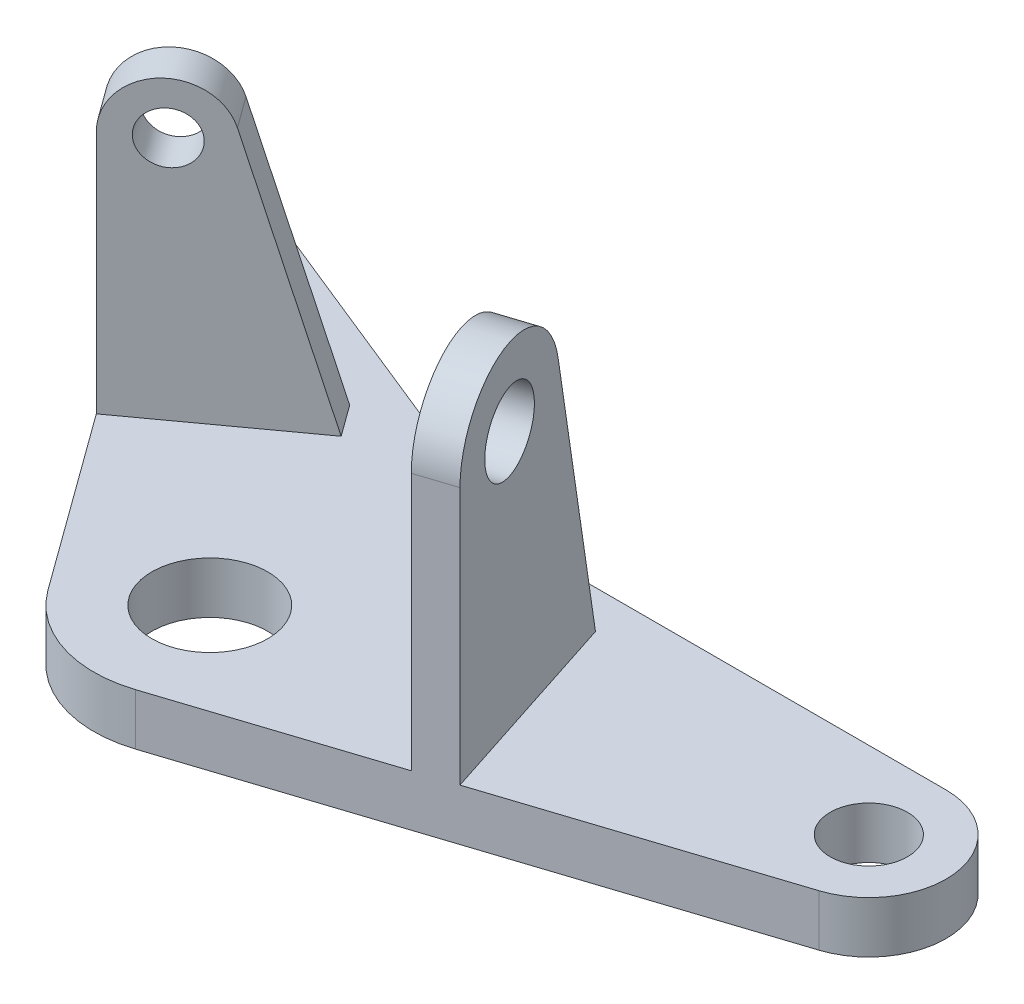
ISO-10303-21;
HEADER;
FILE_DESCRIPTION(('STEP AP214'),'2;1');
FILE_NAME('part.step','',(''),(''),'','','');
FILE_SCHEMA(('AUTOMOTIVE_DESIGN { 1 0 10303 214 1 1 1 1 }'));
ENDSEC;
DATA;
#1=APPLICATION_CONTEXT('core data for automotive mechanical design processes');
#2=APPLICATION_PROTOCOL_DEFINITION('international standard','automotive_design',2000,#1);
#3=PRODUCT_CONTEXT('',#1,'mechanical');
#4=PRODUCT('Part','Part','',(#3));
#5=PRODUCT_RELATED_PRODUCT_CATEGORY('part','',(#4));
#6=PRODUCT_DEFINITION_FORMATION('','',#4);
#7=PRODUCT_DEFINITION_CONTEXT('part definition',#1,'design');
#8=PRODUCT_DEFINITION('design','',#6,#7);
#9=PRODUCT_DEFINITION_SHAPE('','',#8);
#10=(LENGTH_UNIT() NAMED_UNIT(*) SI_UNIT(.MILLI.,.METRE.));
#11=(NAMED_UNIT(*) PLANE_ANGLE_UNIT() SI_UNIT($,.RADIAN.));
#12=(NAMED_UNIT(*) SI_UNIT($,.STERADIAN.) SOLID_ANGLE_UNIT());
#13=UNCERTAINTY_MEASURE_WITH_UNIT(LENGTH_MEASURE(1.E-05),#10,'distance_accuracy_value','');
#14=(GEOMETRIC_REPRESENTATION_CONTEXT(3) GLOBAL_UNCERTAINTY_ASSIGNED_CONTEXT((#13)) GLOBAL_UNIT_ASSIGNED_CONTEXT((#10,
#11,#12)) REPRESENTATION_CONTEXT('',''));
#15=CARTESIAN_POINT('',(0.,0.,0.));
#16=DIRECTION('',(0.,0.,1.));
#17=DIRECTION('',(1.,0.,0.));
#18=AXIS2_PLACEMENT_3D('',#15,#16,#17);
#19=CARTESIAN_POINT('',(0.,8.,0.));
#20=DIRECTION('',(0.,-1.,0.));
#21=DIRECTION('',(0.,0.,-1.));
#22=AXIS2_PLACEMENT_3D('',#19,#20,#21);
#23=PLANE('',#22);
#24=CARTESIAN_POINT('',(82.,8.,-20.3346417456682));
#25=DIRECTION('',(0.,1.,0.));
#26=DIRECTION('',(0.,0.,1.));
#27=AXIS2_PLACEMENT_3D('',#24,#25,#26);
#28=CIRCLE('',#27,6.);
#29=CARTESIAN_POINT('',(82.,8.,-14.3346417456682));
#30=VERTEX_POINT('',#29);
#31=EDGE_CURVE('E223',#30,#30,#28,.T.);
#32=ORIENTED_EDGE('',*,*,#31,.F.);
#33=EDGE_LOOP('',(#32));
#34=FACE_BOUND('',#33,.T.);
#35=CARTESIAN_POINT('',(-48.,8.,-49.0533160155749));
#36=DIRECTION('',(0.,1.,0.));
#37=DIRECTION('',(0.,0.,1.));
#38=AXIS2_PLACEMENT_3D('',#35,#36,#37);
#39=CIRCLE('',#38,4.00000000000001);
#40=CARTESIAN_POINT('',(-48.,8.,-45.0533160155749));
#41=VERTEX_POINT('',#40);
#42=EDGE_CURVE('E229',#41,#41,#39,.T.);
#43=ORIENTED_EDGE('',*,*,#42,.F.);
#44=EDGE_LOOP('',(#43));
#45=FACE_BOUND('',#44,.T.);
#46=CARTESIAN_POINT('',(0.,8.,0.));
#47=DIRECTION('',(0.,1.,0.));
#48=DIRECTION('',(0.,0.,1.));
#49=AXIS2_PLACEMENT_3D('',#46,#47,#48);
#50=CIRCLE('',#49,9.);
#51=CARTESIAN_POINT('',(0.,8.,9.));
#52=VERTEX_POINT('',#51);
#53=EDGE_CURVE('E235',#52,#52,#50,.T.);
#54=ORIENTED_EDGE('',*,*,#53,.F.);
#55=EDGE_LOOP('',(#54));
#56=FACE_BOUND('',#55,.T.);
#57=DIRECTION('',(-0.309016994374941,0.,-0.951056516295156));
#58=VECTOR('',#57,1.);
#59=CARTESIAN_POINT('',(38.0422606518062,8.,-12.3606797749976));
#60=LINE('',#59,#58);
#61=CARTESIAN_POINT('',(43.6045665505552,8.,4.75833751831514));
#62=VERTEX_POINT('',#61);
#63=CARTESIAN_POINT('',(33.477971610946,8.,-26.408117014963));
#64=VERTEX_POINT('',#63);
#65=EDGE_CURVE('E184',#62,#64,#60,.T.);
#66=ORIENTED_EDGE('',*,*,#65,.F.);
#67=DIRECTION('',(0.951056516295155,0.,-0.309016994374942));
#68=VECTOR('',#67,1.);
#69=CARTESIAN_POINT('',(85.7082039324993,8.,-8.92196355012631));
#70=LINE('',#69,#68);
#71=CARTESIAN_POINT('',(85.7082039324993,8.,-8.92196355012631));
#72=VERTEX_POINT('',#71);
#73=EDGE_CURVE('E155',#62,#72,#70,.T.);
#74=ORIENTED_EDGE('',*,*,#73,.T.);
#75=CARTESIAN_POINT('',(82.,8.,-20.3346417456682));
#76=DIRECTION('',(0.,1.,0.));
#77=DIRECTION('',(0.,0.,-1.));
#78=AXIS2_PLACEMENT_3D('',#75,#76,#77);
#79=CIRCLE('',#78,12.);
#80=CARTESIAN_POINT('',(82.,8.,-32.3346417456682));
#81=VERTEX_POINT('',#80);
#82=EDGE_CURVE('E248',#72,#81,#79,.T.);
#83=ORIENTED_EDGE('',*,*,#82,.T.);
#84=DIRECTION('',(-1.,0.,0.));
#85=VECTOR('',#84,1.);
#86=CARTESIAN_POINT('',(22.8998811762116,8.,-32.3346417456682));
#87=LINE('',#86,#85);
#88=CARTESIAN_POINT('',(22.8998811762116,8.,-32.3346417456682));
#89=VERTEX_POINT('',#88);
#90=EDGE_CURVE('E250',#81,#89,#87,.T.);
#91=ORIENTED_EDGE('',*,*,#90,.T.);
#92=CARTESIAN_POINT('',(22.8998811762116,8.,-74.3346417456682));
#93=DIRECTION('',(0.,-1.,0.));
#94=DIRECTION('',(0.,0.,1.));
#95=AXIS2_PLACEMENT_3D('',#92,#93,#94);
#96=CIRCLE('',#95,42.);
#97=CARTESIAN_POINT('',(7.16640425274329,8.,-35.3929198538631));
#98=VERTEX_POINT('',#97);
#99=EDGE_CURVE('E252',#89,#98,#96,.T.);
#100=ORIENTED_EDGE('',*,*,#99,.T.);
#101=DIRECTION('',(-0.927183854566787,0.,-0.374606593415913));
#102=VECTOR('',#101,1.);
#103=CARTESIAN_POINT('',(-45.0031472526727,8.,-56.4707868521092));
#104=LINE('',#103,#102);
#105=CARTESIAN_POINT('',(-45.0031472526727,8.,-56.4707868521092));
#106=VERTEX_POINT('',#105);
#107=EDGE_CURVE('E254',#98,#106,#104,.T.);
#108=ORIENTED_EDGE('',*,*,#107,.T.);
#109=CARTESIAN_POINT('',(-48.,8.,-49.0533160155749));
#110=DIRECTION('',(0.,1.,0.));
#111=DIRECTION('',(0.,0.,-1.));
#112=AXIS2_PLACEMENT_3D('',#109,#110,#111);
#113=CIRCLE('',#112,8.00000000000001);
#114=CARTESIAN_POINT('',(-54.4721359549996,8.,-44.3510339972351));
#115=VERTEX_POINT('',#114);
#116=EDGE_CURVE('E256',#106,#115,#113,.T.);
#117=ORIENTED_EDGE('',*,*,#116,.T.);
#118=DIRECTION('',(0.587785252292478,0.,0.809016994374944));
#119=VECTOR('',#118,1.);
#120=CARTESIAN_POINT('',(-14.562305898749,8.,10.5801345412646));
#121=LINE('',#120,#119);
#122=CARTESIAN_POINT('',(-38.0737159904481,8.,-21.7805452337332));
#123=VERTEX_POINT('',#122);
#124=EDGE_CURVE('E259',#115,#123,#121,.T.);
#125=ORIENTED_EDGE('',*,*,#124,.T.);
#126=DIRECTION('',(0.809016994374944,0.,-0.587785252292478));
#127=VECTOR('',#126,1.);
#128=CARTESIAN_POINT('',(-23.5114100916991,8.,-32.3606797749978));
#129=LINE('',#128,#127);
#130=CARTESIAN_POINT('',(-16.0533088274187,8.,-37.7793075216681));
#131=VERTEX_POINT('',#130);
#132=EDGE_CURVE('E57',#123,#131,#129,.T.);
#133=ORIENTED_EDGE('',*,*,#132,.T.);
#134=DIRECTION('',(0.587785252292478,0.,0.809016994374944));
#135=VECTOR('',#134,1.);
#136=CARTESIAN_POINT('',(7.45810126428037,8.,-5.41862774667031));
#137=LINE('',#136,#135);
#138=CARTESIAN_POINT('',(-12.5265973136639,8.,-32.9252055554184));
#139=VERTEX_POINT('',#138);
#140=EDGE_CURVE('E220',#131,#139,#137,.T.);
#141=ORIENTED_EDGE('',*,*,#140,.T.);
#142=DIRECTION('',(0.809016994374944,0.,-0.587785252292478));
#143=VECTOR('',#142,1.);
#144=CARTESIAN_POINT('',(-19.9846985779443,8.,-27.5065778087481));
#145=LINE('',#144,#143);
#146=CARTESIAN_POINT('',(-34.5470044766932,8.,-16.9264432674835));
#147=VERTEX_POINT('',#146);
#148=EDGE_CURVE('E214',#147,#139,#145,.T.);
#149=ORIENTED_EDGE('',*,*,#148,.F.);
#150=CARTESIAN_POINT('',(-14.562305898749,8.,10.5801345412646));
#151=VERTEX_POINT('',#150);
#152=EDGE_CURVE('E258',#147,#151,#121,.T.);
#153=ORIENTED_EDGE('',*,*,#152,.T.);
#154=CARTESIAN_POINT('',(0.,8.,0.));
#155=DIRECTION('',(0.,1.,0.));
#156=DIRECTION('',(0.,0.,-1.));
#157=AXIS2_PLACEMENT_3D('',#154,#155,#156);
#158=CIRCLE('',#157,18.);
#159=CARTESIAN_POINT('',(5.56230589874895,8.,17.1190172933128));
#160=VERTEX_POINT('',#159);
#161=EDGE_CURVE('E241',#151,#160,#158,.T.);
#162=ORIENTED_EDGE('',*,*,#161,.T.);
#163=CARTESIAN_POINT('',(37.8982274527842,8.,6.61243948456478));
#164=VERTEX_POINT('',#163);
#165=EDGE_CURVE('E245',#160,#164,#70,.T.);
#166=ORIENTED_EDGE('',*,*,#165,.T.);
#167=DIRECTION('',(-0.309016994374941,0.,-0.951056516295156));
#168=VECTOR('',#167,1.);
#169=CARTESIAN_POINT('',(32.3359215540353,8.,-10.506577808748));
#170=LINE('',#169,#168);
#171=CARTESIAN_POINT('',(27.771632513175,8.,-24.5540150487134));
#172=VERTEX_POINT('',#171);
#173=EDGE_CURVE('E180',#164,#172,#170,.T.);
#174=ORIENTED_EDGE('',*,*,#173,.T.);
#175=DIRECTION('',(0.951056516295156,0.,-0.309016994374941));
#176=VECTOR('',#175,1.);
#177=CARTESIAN_POINT('',(-4.56428904086026,8.,-14.0474372399654));
#178=LINE('',#177,#176);
#179=EDGE_CURVE('E186',#172,#64,#178,.T.);
#180=ORIENTED_EDGE('',*,*,#179,.T.);
#181=EDGE_LOOP('',(#66,#74,#83,#91,#100,#108,#117,#125,#133,#141,#149,#153,#162,#166,#174,#180));
#182=FACE_BOUND('',#181,.T.);
#183=ADVANCED_FACE('F34',(#34,#45,#56,#182),#23,.F.);
#184=CARTESIAN_POINT('',(0.,0.,0.));
#185=DIRECTION('',(0.,-1.,0.));
#186=DIRECTION('',(0.,0.,-1.));
#187=AXIS2_PLACEMENT_3D('',#184,#185,#186);
#188=PLANE('',#187);
#189=CARTESIAN_POINT('',(82.,0.,-20.3346417456682));
#190=DIRECTION('',(0.,1.,0.));
#191=DIRECTION('',(0.,0.,-1.));
#192=AXIS2_PLACEMENT_3D('',#189,#190,#191);
#193=CIRCLE('',#192,12.);
#194=CARTESIAN_POINT('',(85.7082039324993,0.,-8.92196355012631));
#195=VERTEX_POINT('',#194);
#196=CARTESIAN_POINT('',(82.,0.,-32.3346417456682));
#197=VERTEX_POINT('',#196);
#198=EDGE_CURVE('E266',#195,#197,#193,.T.);
#199=ORIENTED_EDGE('',*,*,#198,.F.);
#200=DIRECTION('',(0.951056516295155,0.,-0.309016994374942));
#201=VECTOR('',#200,1.);
#202=CARTESIAN_POINT('',(85.7082039324993,0.,-8.92196355012631));
#203=LINE('',#202,#201);
#204=CARTESIAN_POINT('',(5.56230589874895,0.,17.1190172933128));
#205=VERTEX_POINT('',#204);
#206=EDGE_CURVE('E264',#205,#195,#203,.T.);
#207=ORIENTED_EDGE('',*,*,#206,.F.);
#208=CARTESIAN_POINT('',(0.,0.,0.));
#209=DIRECTION('',(0.,1.,0.));
#210=DIRECTION('',(0.,0.,-1.));
#211=AXIS2_PLACEMENT_3D('',#208,#209,#210);
#212=CIRCLE('',#211,18.);
#213=CARTESIAN_POINT('',(-14.562305898749,0.,10.5801345412646));
#214=VERTEX_POINT('',#213);
#215=EDGE_CURVE('E238',#214,#205,#212,.T.);
#216=ORIENTED_EDGE('',*,*,#215,.F.);
#217=DIRECTION('',(0.587785252292478,0.,0.809016994374944));
#218=VECTOR('',#217,1.);
#219=CARTESIAN_POINT('',(-14.562305898749,0.,10.5801345412646));
#220=LINE('',#219,#218);
#221=CARTESIAN_POINT('',(-54.4721359549996,0.,-44.3510339972351));
#222=VERTEX_POINT('',#221);
#223=EDGE_CURVE('E244',#222,#214,#220,.T.);
#224=ORIENTED_EDGE('',*,*,#223,.F.);
#225=CARTESIAN_POINT('',(-48.,0.,-49.0533160155749));
#226=DIRECTION('',(0.,1.,0.));
#227=DIRECTION('',(0.,0.,-1.));
#228=AXIS2_PLACEMENT_3D('',#225,#226,#227);
#229=CIRCLE('',#228,8.00000000000001);
#230=CARTESIAN_POINT('',(-45.0031472526727,0.,-56.4707868521092));
#231=VERTEX_POINT('',#230);
#232=EDGE_CURVE('E274',#231,#222,#229,.T.);
#233=ORIENTED_EDGE('',*,*,#232,.F.);
#234=DIRECTION('',(-0.927183854566787,0.,-0.374606593415913));
#235=VECTOR('',#234,1.);
#236=CARTESIAN_POINT('',(-45.0031472526727,0.,-56.4707868521092));
#237=LINE('',#236,#235);
#238=CARTESIAN_POINT('',(7.16640425274329,0.,-35.3929198538631));
#239=VERTEX_POINT('',#238);
#240=EDGE_CURVE('E272',#239,#231,#237,.T.);
#241=ORIENTED_EDGE('',*,*,#240,.F.);
#242=CARTESIAN_POINT('',(22.8998811762116,0.,-74.3346417456682));
#243=DIRECTION('',(0.,-1.,0.));
#244=DIRECTION('',(0.,0.,1.));
#245=AXIS2_PLACEMENT_3D('',#242,#243,#244);
#246=CIRCLE('',#245,42.);
#247=CARTESIAN_POINT('',(22.8998811762116,0.,-32.3346417456682));
#248=VERTEX_POINT('',#247);
#249=EDGE_CURVE('E270',#248,#239,#246,.T.);
#250=ORIENTED_EDGE('',*,*,#249,.F.);
#251=DIRECTION('',(-1.,0.,0.));
#252=VECTOR('',#251,1.);
#253=CARTESIAN_POINT('',(22.8998811762116,0.,-32.3346417456682));
#254=LINE('',#253,#252);
#255=EDGE_CURVE('E268',#197,#248,#254,.T.);
#256=ORIENTED_EDGE('',*,*,#255,.F.);
#257=EDGE_LOOP('',(#199,#207,#216,#224,#233,#241,#250,#256));
#258=FACE_BOUND('',#257,.T.);
#259=CARTESIAN_POINT('',(-48.,0.,-49.0533160155749));
#260=DIRECTION('',(0.,1.,0.));
#261=DIRECTION('',(0.,0.,1.));
#262=AXIS2_PLACEMENT_3D('',#259,#260,#261);
#263=CIRCLE('',#262,4.00000000000001);
#264=CARTESIAN_POINT('',(-48.,0.,-45.0533160155749));
#265=VERTEX_POINT('',#264);
#266=EDGE_CURVE('E226',#265,#265,#263,.T.);
#267=ORIENTED_EDGE('',*,*,#266,.T.);
#268=EDGE_LOOP('',(#267));
#269=FACE_BOUND('',#268,.T.);
#270=CARTESIAN_POINT('',(0.,0.,0.));
#271=DIRECTION('',(0.,1.,0.));
#272=DIRECTION('',(0.,0.,1.));
#273=AXIS2_PLACEMENT_3D('',#270,#271,#272);
#274=CIRCLE('',#273,9.);
#275=CARTESIAN_POINT('',(0.,0.,9.));
#276=VERTEX_POINT('',#275);
#277=EDGE_CURVE('E232',#276,#276,#274,.T.);
#278=ORIENTED_EDGE('',*,*,#277,.T.);
#279=EDGE_LOOP('',(#278));
#280=FACE_BOUND('',#279,.T.);
#281=CARTESIAN_POINT('',(82.,0.,-20.3346417456682));
#282=DIRECTION('',(0.,1.,0.));
#283=DIRECTION('',(0.,0.,1.));
#284=AXIS2_PLACEMENT_3D('',#281,#282,#283);
#285=CIRCLE('',#284,6.);
#286=CARTESIAN_POINT('',(82.,0.,-14.3346417456682));
#287=VERTEX_POINT('',#286);
#288=EDGE_CURVE('E222',#287,#287,#285,.T.);
#289=ORIENTED_EDGE('',*,*,#288,.T.);
#290=EDGE_LOOP('',(#289));
#291=FACE_BOUND('',#290,.T.);
#292=ADVANCED_FACE('F301',(#258,#269,#280,#291),#188,.T.);
#293=CARTESIAN_POINT('',(0.,8.,0.));
#294=DIRECTION('',(0.,-1.,0.));
#295=DIRECTION('',(0.,0.,-1.));
#296=AXIS2_PLACEMENT_3D('',#293,#294,#295);
#297=CYLINDRICAL_SURFACE('',#296,18.);
#298=ORIENTED_EDGE('',*,*,#215,.T.);
#299=DIRECTION('',(0.,-1.,0.));
#300=VECTOR('',#299,1.);
#301=CARTESIAN_POINT('',(5.56230589874895,8.,17.1190172933128));
#302=LINE('',#301,#300);
#303=EDGE_CURVE('E11',#160,#205,#302,.T.);
#304=ORIENTED_EDGE('',*,*,#303,.F.);
#305=ORIENTED_EDGE('',*,*,#161,.F.);
#306=DIRECTION('',(0.,-1.,0.));
#307=VECTOR('',#306,1.);
#308=CARTESIAN_POINT('',(-14.562305898749,8.,10.5801345412646));
#309=LINE('',#308,#307);
#310=EDGE_CURVE('E261',#151,#214,#309,.T.);
#311=ORIENTED_EDGE('',*,*,#310,.T.);
#312=EDGE_LOOP('',(#298,#304,#305,#311));
#313=FACE_BOUND('',#312,.T.);
#314=ADVANCED_FACE('F36',(#313),#297,.T.);
#315=CARTESIAN_POINT('',(85.7082039324993,8.,-8.92196355012631));
#316=DIRECTION('',(-0.309016994374942,0.,-0.951056516295155));
#317=DIRECTION('',(-0.951056516295155,0.,0.309016994374942));
#318=AXIS2_PLACEMENT_3D('',#315,#316,#317);
#319=PLANE('',#318);
#320=ORIENTED_EDGE('',*,*,#206,.T.);
#321=DIRECTION('',(0.,-1.,0.));
#322=VECTOR('',#321,1.);
#323=CARTESIAN_POINT('',(85.7082039324993,8.,-8.92196355012631));
#324=LINE('',#323,#322);
#325=EDGE_CURVE('E42',#72,#195,#324,.T.);
#326=ORIENTED_EDGE('',*,*,#325,.F.);
#327=ORIENTED_EDGE('',*,*,#73,.F.);
#328=DIRECTION('',(0.,1.,0.));
#329=VECTOR('',#328,1.);
#330=CARTESIAN_POINT('',(43.6045665505552,0.,4.75833751831514));
#331=LINE('',#330,#329);
#332=CARTESIAN_POINT('',(43.6045665505552,48.,4.75833751831514));
#333=VERTEX_POINT('',#332);
#334=EDGE_CURVE('E148',#62,#333,#331,.T.);
#335=ORIENTED_EDGE('',*,*,#334,.T.);
#336=DIRECTION('',(-0.951056516295155,0.,0.309016994374941));
#337=VECTOR('',#336,1.);
#338=CARTESIAN_POINT('',(43.6045665505552,48.,4.75833751831514));
#339=LINE('',#338,#337);
#340=CARTESIAN_POINT('',(37.8982274527842,48.,6.61243948456479));
#341=VERTEX_POINT('',#340);
#342=EDGE_CURVE('E152',#333,#341,#339,.T.);
#343=ORIENTED_EDGE('',*,*,#342,.T.);
#344=DIRECTION('',(0.,1.,0.));
#345=VECTOR('',#344,1.);
#346=CARTESIAN_POINT('',(37.8982274527842,0.,6.61243948456478));
#347=LINE('',#346,#345);
#348=EDGE_CURVE('E175',#164,#341,#347,.T.);
#349=ORIENTED_EDGE('',*,*,#348,.F.);
#350=ORIENTED_EDGE('',*,*,#165,.F.);
#351=ORIENTED_EDGE('',*,*,#303,.T.);
#352=EDGE_LOOP('',(#320,#326,#327,#335,#343,#349,#350,#351));
#353=FACE_BOUND('',#352,.T.);
#354=ADVANCED_FACE('F150',(#353),#319,.F.);
#355=CARTESIAN_POINT('',(82.,8.,-20.3346417456682));
#356=DIRECTION('',(0.,-1.,0.));
#357=DIRECTION('',(0.,0.,-1.));
#358=AXIS2_PLACEMENT_3D('',#355,#356,#357);
#359=CYLINDRICAL_SURFACE('',#358,12.);
#360=ORIENTED_EDGE('',*,*,#198,.T.);
#361=DIRECTION('',(0.,-1.,0.));
#362=VECTOR('',#361,1.);
#363=CARTESIAN_POINT('',(82.,8.,-32.3346417456682));
#364=LINE('',#363,#362);
#365=EDGE_CURVE('E291',#81,#197,#364,.T.);
#366=ORIENTED_EDGE('',*,*,#365,.F.);
#367=ORIENTED_EDGE('',*,*,#82,.F.);
#368=ORIENTED_EDGE('',*,*,#325,.T.);
#369=EDGE_LOOP('',(#360,#366,#367,#368));
#370=FACE_BOUND('',#369,.T.);
#371=ADVANCED_FACE('F297',(#370),#359,.T.);
#372=CARTESIAN_POINT('',(22.8998811762116,8.,-32.3346417456682));
#373=DIRECTION('',(0.,0.,1.));
#374=DIRECTION('',(1.,0.,0.));
#375=AXIS2_PLACEMENT_3D('',#372,#373,#374);
#376=PLANE('',#375);
#377=ORIENTED_EDGE('',*,*,#255,.T.);
#378=DIRECTION('',(0.,-1.,0.));
#379=VECTOR('',#378,1.);
#380=CARTESIAN_POINT('',(22.8998811762116,8.,-32.3346417456682));
#381=LINE('',#380,#379);
#382=EDGE_CURVE('E288',#89,#248,#381,.T.);
#383=ORIENTED_EDGE('',*,*,#382,.F.);
#384=ORIENTED_EDGE('',*,*,#90,.F.);
#385=ORIENTED_EDGE('',*,*,#365,.T.);
#386=EDGE_LOOP('',(#377,#383,#384,#385));
#387=FACE_BOUND('',#386,.T.);
#388=ADVANCED_FACE('F308',(#387),#376,.F.);
#389=CARTESIAN_POINT('',(22.8998811762116,8.,-74.3346417456682));
#390=DIRECTION('',(0.,-1.,0.));
#391=DIRECTION('',(0.,0.,-1.));
#392=AXIS2_PLACEMENT_3D('',#389,#390,#391);
#393=CYLINDRICAL_SURFACE('',#392,42.);
#394=ORIENTED_EDGE('',*,*,#249,.T.);
#395=DIRECTION('',(0.,-1.,0.));
#396=VECTOR('',#395,1.);
#397=CARTESIAN_POINT('',(7.16640425274329,8.,-35.3929198538631));
#398=LINE('',#397,#396);
#399=EDGE_CURVE('E285',#98,#239,#398,.T.);
#400=ORIENTED_EDGE('',*,*,#399,.F.);
#401=ORIENTED_EDGE('',*,*,#99,.F.);
#402=ORIENTED_EDGE('',*,*,#382,.T.);
#403=EDGE_LOOP('',(#394,#400,#401,#402));
#404=FACE_BOUND('',#403,.T.);
#405=ADVANCED_FACE('F312',(#404),#393,.F.);
#406=CARTESIAN_POINT('',(-45.0031472526727,8.,-56.4707868521092));
#407=DIRECTION('',(-0.374606593415913,0.,0.927183854566787));
#408=DIRECTION('',(0.927183854566787,0.,0.374606593415913));
#409=AXIS2_PLACEMENT_3D('',#406,#407,#408);
#410=PLANE('',#409);
#411=ORIENTED_EDGE('',*,*,#240,.T.);
#412=DIRECTION('',(0.,-1.,0.));
#413=VECTOR('',#412,1.);
#414=CARTESIAN_POINT('',(-45.0031472526727,8.,-56.4707868521092));
#415=LINE('',#414,#413);
#416=EDGE_CURVE('E282',#106,#231,#415,.T.);
#417=ORIENTED_EDGE('',*,*,#416,.F.);
#418=ORIENTED_EDGE('',*,*,#107,.F.);
#419=ORIENTED_EDGE('',*,*,#399,.T.);
#420=EDGE_LOOP('',(#411,#417,#418,#419));
#421=FACE_BOUND('',#420,.T.);
#422=ADVANCED_FACE('F334',(#421),#410,.F.);
#423=CARTESIAN_POINT('',(-48.,8.,-49.0533160155749));
#424=DIRECTION('',(0.,-1.,0.));
#425=DIRECTION('',(0.,0.,-1.));
#426=AXIS2_PLACEMENT_3D('',#423,#424,#425);
#427=CYLINDRICAL_SURFACE('',#426,8.00000000000001);
#428=ORIENTED_EDGE('',*,*,#232,.T.);
#429=DIRECTION('',(0.,-1.,0.));
#430=VECTOR('',#429,1.);
#431=CARTESIAN_POINT('',(-54.4721359549996,8.,-44.3510339972351));
#432=LINE('',#431,#430);
#433=EDGE_CURVE('E279',#115,#222,#432,.T.);
#434=ORIENTED_EDGE('',*,*,#433,.F.);
#435=ORIENTED_EDGE('',*,*,#116,.F.);
#436=ORIENTED_EDGE('',*,*,#416,.T.);
#437=EDGE_LOOP('',(#428,#434,#435,#436));
#438=FACE_BOUND('',#437,.T.);
#439=ADVANCED_FACE('F332',(#438),#427,.T.);
#440=CARTESIAN_POINT('',(-14.562305898749,8.,10.5801345412646));
#441=DIRECTION('',(0.809016994374944,0.,-0.587785252292478));
#442=DIRECTION('',(-0.587785252292478,0.,-0.809016994374944));
#443=AXIS2_PLACEMENT_3D('',#440,#441,#442);
#444=PLANE('',#443);
#445=ORIENTED_EDGE('',*,*,#223,.T.);
#446=ORIENTED_EDGE('',*,*,#310,.F.);
#447=ORIENTED_EDGE('',*,*,#152,.F.);
#448=DIRECTION('',(0.,-1.,0.));
#449=VECTOR('',#448,1.);
#450=CARTESIAN_POINT('',(-34.5470044766932,0.,-16.9264432674835));
#451=LINE('',#450,#449);
#452=CARTESIAN_POINT('',(-34.5470044766933,46.,-16.9264432674835));
#453=VERTEX_POINT('',#452);
#454=EDGE_CURVE('E199',#453,#147,#451,.T.);
#455=ORIENTED_EDGE('',*,*,#454,.F.);
#456=DIRECTION('',(0.587785252292478,0.,0.809016994374944));
#457=VECTOR('',#456,1.);
#458=CARTESIAN_POINT('',(-38.0737159904481,46.,-21.7805452337332));
#459=LINE('',#458,#457);
#460=CARTESIAN_POINT('',(-38.0737159904481,46.,-21.7805452337332));
#461=VERTEX_POINT('',#460);
#462=EDGE_CURVE('E212',#461,#453,#459,.T.);
#463=ORIENTED_EDGE('',*,*,#462,.F.);
#464=DIRECTION('',(0.,-1.,0.));
#465=VECTOR('',#464,1.);
#466=CARTESIAN_POINT('',(-38.0737159904481,0.,-21.7805452337332));
#467=LINE('',#466,#465);
#468=EDGE_CURVE('E202',#461,#123,#467,.T.);
#469=ORIENTED_EDGE('',*,*,#468,.T.);
#470=ORIENTED_EDGE('',*,*,#124,.F.);
#471=ORIENTED_EDGE('',*,*,#433,.T.);
#472=EDGE_LOOP('',(#445,#446,#447,#455,#463,#469,#470,#471));
#473=FACE_BOUND('',#472,.T.);
#474=ADVANCED_FACE('F327',(#473),#444,.F.);
#475=CARTESIAN_POINT('',(0.,8.,0.));
#476=DIRECTION('',(0.,-1.,0.));
#477=DIRECTION('',(0.,0.,-1.));
#478=AXIS2_PLACEMENT_3D('',#475,#476,#477);
#479=CYLINDRICAL_SURFACE('',#478,9.);
#480=ORIENTED_EDGE('',*,*,#53,.T.);
#481=EDGE_LOOP('',(#480));
#482=FACE_BOUND('',#481,.T.);
#483=ORIENTED_EDGE('',*,*,#277,.F.);
#484=EDGE_LOOP('',(#483));
#485=FACE_BOUND('',#484,.T.);
#486=ADVANCED_FACE('F353',(#482,#485),#479,.F.);
#487=CARTESIAN_POINT('',(-48.,8.,-49.0533160155749));
#488=DIRECTION('',(0.,-1.,0.));
#489=DIRECTION('',(0.,0.,-1.));
#490=AXIS2_PLACEMENT_3D('',#487,#488,#489);
#491=CYLINDRICAL_SURFACE('',#490,4.00000000000001);
#492=ORIENTED_EDGE('',*,*,#42,.T.);
#493=EDGE_LOOP('',(#492));
#494=FACE_BOUND('',#493,.T.);
#495=ORIENTED_EDGE('',*,*,#266,.F.);
#496=EDGE_LOOP('',(#495));
#497=FACE_BOUND('',#496,.T.);
#498=ADVANCED_FACE('F360',(#494,#497),#491,.F.);
#499=CARTESIAN_POINT('',(82.,8.,-20.3346417456682));
#500=DIRECTION('',(0.,-1.,0.));
#501=DIRECTION('',(0.,0.,-1.));
#502=AXIS2_PLACEMENT_3D('',#499,#500,#501);
#503=CYLINDRICAL_SURFACE('',#502,6.);
#504=ORIENTED_EDGE('',*,*,#31,.T.);
#505=EDGE_LOOP('',(#504));
#506=FACE_BOUND('',#505,.T.);
#507=ORIENTED_EDGE('',*,*,#288,.F.);
#508=EDGE_LOOP('',(#507));
#509=FACE_BOUND('',#508,.T.);
#510=ADVANCED_FACE('F365',(#506,#509),#503,.F.);
#511=CARTESIAN_POINT('',(-25.3801636510023,48.205098846536,-31.0029508398026));
#512=DIRECTION('',(0.777677048055779,0.275637355817003,-0.565015448466199));
#513=DIRECTION('',(-0.587785252292478,0.,-0.809016994374944));
#514=AXIS2_PLACEMENT_3D('',#511,#512,#513);
#515=PLANE('',#514);
#516=ORIENTED_EDGE('',*,*,#140,.F.);
#517=DIRECTION('',(-0.222995305140529,0.961261695938318,0.162015572730129));
#518=VECTOR('',#517,1.);
#519=CARTESIAN_POINT('',(-25.3801636510023,48.205098846536,-31.0029508398026));
#520=LINE('',#519,#518);
#521=CARTESIAN_POINT('',(-25.3801636510023,48.205098846536,-31.0029508398026));
#522=VERTEX_POINT('',#521);
#523=EDGE_CURVE('E196',#131,#522,#520,.T.);
#524=ORIENTED_EDGE('',*,*,#523,.T.);
#525=DIRECTION('',(0.587785252292478,0.,0.809016994374944));
#526=VECTOR('',#525,1.);
#527=CARTESIAN_POINT('',(-25.3801636510023,48.205098846536,-31.0029508398026));
#528=LINE('',#527,#526);
#529=CARTESIAN_POINT('',(-21.8534521372475,48.205098846536,-26.1488488735529));
#530=VERTEX_POINT('',#529);
#531=EDGE_CURVE('E205',#522,#530,#528,.T.);
#532=ORIENTED_EDGE('',*,*,#531,.T.);
#533=DIRECTION('',(-0.222995305140529,0.961261695938318,0.162015572730129));
#534=VECTOR('',#533,1.);
#535=CARTESIAN_POINT('',(-21.8534521372475,48.205098846536,-26.1488488735529));
#536=LINE('',#535,#534);
#537=EDGE_CURVE('E193',#139,#530,#536,.T.);
#538=ORIENTED_EDGE('',*,*,#537,.F.);
#539=EDGE_LOOP('',(#516,#524,#532,#538));
#540=FACE_BOUND('',#539,.T.);
#541=ADVANCED_FACE('F375',(#540),#515,.T.);
#542=CARTESIAN_POINT('',(-31.6015800354486,46.,-26.482827252073));
#543=DIRECTION('',(-0.587785252292478,0.,-0.809016994374944));
#544=DIRECTION('',(-0.809016994374944,0.,0.587785252292478));
#545=AXIS2_PLACEMENT_3D('',#542,#543,#544);
#546=PLANE('',#545);
#547=CARTESIAN_POINT('',(-31.6015800354486,46.,-26.482827252073));
#548=DIRECTION('',(0.587785252292478,0.,0.809016994374944));
#549=DIRECTION('',(0.809016994374944,0.,-0.587785252292478));
#550=AXIS2_PLACEMENT_3D('',#547,#548,#549);
#551=CIRCLE('',#550,4.);
#552=CARTESIAN_POINT('',(-28.3655120579488,46.,-28.8339682612429));
#553=VERTEX_POINT('',#552);
#554=EDGE_CURVE('E190',#553,#553,#551,.T.);
#555=ORIENTED_EDGE('',*,*,#554,.T.);
#556=EDGE_LOOP('',(#555));
#557=FACE_BOUND('',#556,.T.);
#558=ORIENTED_EDGE('',*,*,#132,.F.);
#559=ORIENTED_EDGE('',*,*,#468,.F.);
#560=CARTESIAN_POINT('',(-31.6015800354486,46.,-26.482827252073));
#561=DIRECTION('',(0.587785252292478,0.,0.809016994374944));
#562=DIRECTION('',(-0.809016994374944,0.,0.587785252292478));
#563=AXIS2_PLACEMENT_3D('',#560,#561,#562);
#564=CIRCLE('',#563,8.);
#565=EDGE_CURVE('E198',#522,#461,#564,.T.);
#566=ORIENTED_EDGE('',*,*,#565,.F.);
#567=ORIENTED_EDGE('',*,*,#523,.F.);
#568=EDGE_LOOP('',(#558,#559,#566,#567));
#569=FACE_BOUND('',#568,.T.);
#570=ADVANCED_FACE('F381',(#557,#569),#546,.T.);
#571=CARTESIAN_POINT('',(-28.0748685216937,46.,-21.6287252858233));
#572=DIRECTION('',(-0.587785252292478,0.,-0.809016994374944));
#573=DIRECTION('',(-0.809016994374944,0.,0.587785252292478));
#574=AXIS2_PLACEMENT_3D('',#571,#572,#573);
#575=PLANE('',#574);
#576=CARTESIAN_POINT('',(-28.0748685216937,46.,-21.6287252858233));
#577=DIRECTION('',(0.587785252292478,0.,0.809016994374944));
#578=DIRECTION('',(0.809016994374944,0.,-0.587785252292478));
#579=AXIS2_PLACEMENT_3D('',#576,#577,#578);
#580=CIRCLE('',#579,4.);
#581=CARTESIAN_POINT('',(-24.8388005441939,46.,-23.9798662949932));
#582=VERTEX_POINT('',#581);
#583=EDGE_CURVE('E189',#582,#582,#580,.T.);
#584=ORIENTED_EDGE('',*,*,#583,.F.);
#585=EDGE_LOOP('',(#584));
#586=FACE_BOUND('',#585,.T.);
#587=ORIENTED_EDGE('',*,*,#454,.T.);
#588=ORIENTED_EDGE('',*,*,#148,.T.);
#589=ORIENTED_EDGE('',*,*,#537,.T.);
#590=CARTESIAN_POINT('',(-28.0748685216937,46.,-21.6287252858233));
#591=DIRECTION('',(0.587785252292478,0.,0.809016994374944));
#592=DIRECTION('',(-0.809016994374944,0.,0.587785252292478));
#593=AXIS2_PLACEMENT_3D('',#590,#591,#592);
#594=CIRCLE('',#593,8.);
#595=EDGE_CURVE('E207',#530,#453,#594,.T.);
#596=ORIENTED_EDGE('',*,*,#595,.T.);
#597=EDGE_LOOP('',(#587,#588,#589,#596));
#598=FACE_BOUND('',#597,.T.);
#599=ADVANCED_FACE('F389',(#586,#598),#575,.F.);
#600=CARTESIAN_POINT('',(-31.6015800354486,46.,-26.482827252073));
#601=DIRECTION('',(0.587785252292478,0.,0.809016994374944));
#602=DIRECTION('',(0.809016994374944,0.,-0.587785252292478));
#603=AXIS2_PLACEMENT_3D('',#600,#601,#602);
#604=CYLINDRICAL_SURFACE('',#603,8.);
#605=ORIENTED_EDGE('',*,*,#595,.F.);
#606=ORIENTED_EDGE('',*,*,#531,.F.);
#607=ORIENTED_EDGE('',*,*,#565,.T.);
#608=ORIENTED_EDGE('',*,*,#462,.T.);
#609=EDGE_LOOP('',(#605,#606,#607,#608));
#610=FACE_BOUND('',#609,.T.);
#611=ADVANCED_FACE('F385',(#610),#604,.T.);
#612=CARTESIAN_POINT('',(-31.6015800354486,46.,-26.482827252073));
#613=DIRECTION('',(0.587785252292478,0.,0.809016994374944));
#614=DIRECTION('',(0.809016994374944,0.,-0.587785252292478));
#615=AXIS2_PLACEMENT_3D('',#612,#613,#614);
#616=CYLINDRICAL_SURFACE('',#615,4.);
#617=ORIENTED_EDGE('',*,*,#554,.F.);
#618=EDGE_LOOP('',(#617));
#619=FACE_BOUND('',#618,.T.);
#620=ORIENTED_EDGE('',*,*,#583,.T.);
#621=EDGE_LOOP('',(#620));
#622=FACE_BOUND('',#621,.T.);
#623=ADVANCED_FACE('F388',(#619,#622),#616,.F.);
#624=CARTESIAN_POINT('',(36.26919183845,50.4949402898132,-17.817624472143));
#625=DIRECTION('',(-0.30226423163382,0.207911690817763,-0.930273649576357));
#626=DIRECTION('',(-0.951056516295156,0.,0.309016994374941));
#627=AXIS2_PLACEMENT_3D('',#624,#625,#626);
#628=PLANE('',#627);
#629=ORIENTED_EDGE('',*,*,#179,.F.);
#630=DIRECTION('',(-0.0642482457919172,-0.978147600733805,-0.197735768366177));
#631=VECTOR('',#630,1.);
#632=CARTESIAN_POINT('',(30.5628527406791,50.4949402898132,-15.9635225058934));
#633=LINE('',#632,#631);
#634=CARTESIAN_POINT('',(30.5628527406791,50.4949402898132,-15.9635225058934));
#635=VERTEX_POINT('',#634);
#636=EDGE_CURVE('E49',#635,#172,#633,.T.);
#637=ORIENTED_EDGE('',*,*,#636,.F.);
#638=DIRECTION('',(-0.951056516295155,0.,0.309016994374941));
#639=VECTOR('',#638,1.);
#640=CARTESIAN_POINT('',(36.26919183845,50.4949402898132,-17.817624472143));
#641=LINE('',#640,#639);
#642=CARTESIAN_POINT('',(36.26919183845,50.4949402898132,-17.817624472143));
#643=VERTEX_POINT('',#642);
#644=EDGE_CURVE('E166',#643,#635,#641,.T.);
#645=ORIENTED_EDGE('',*,*,#644,.F.);
#646=DIRECTION('',(-0.0642482457919172,-0.978147600733805,-0.197735768366177));
#647=VECTOR('',#646,1.);
#648=CARTESIAN_POINT('',(36.26919183845,50.4949402898132,-17.817624472143));
#649=LINE('',#648,#647);
#650=EDGE_CURVE('E167',#643,#64,#649,.T.);
#651=ORIENTED_EDGE('',*,*,#650,.T.);
#652=EDGE_LOOP('',(#629,#637,#645,#651));
#653=FACE_BOUND('',#652,.T.);
#654=ADVANCED_FACE('F317',(#653),#628,.T.);
#655=CARTESIAN_POINT('',(39.8963626180559,48.,-6.65434067722673));
#656=DIRECTION('',(-0.951056516295156,0.,0.309016994374941));
#657=DIRECTION('',(0.309016994374941,0.,0.951056516295156));
#658=AXIS2_PLACEMENT_3D('',#655,#656,#657);
#659=PLANE('',#658);
#660=CARTESIAN_POINT('',(39.8963626180559,48.,-6.65434067722673));
#661=DIRECTION('',(-0.951056516295156,0.,0.309016994374941));
#662=DIRECTION('',(0.309016994374941,0.,0.951056516295156));
#663=AXIS2_PLACEMENT_3D('',#660,#661,#662);
#664=CIRCLE('',#663,6.);
#665=CARTESIAN_POINT('',(41.7504645843055,48.,-0.948001579455797));
#666=VERTEX_POINT('',#665);
#667=EDGE_CURVE('E177',#666,#666,#664,.T.);
#668=ORIENTED_EDGE('',*,*,#667,.T.);
#669=EDGE_LOOP('',(#668));
#670=FACE_BOUND('',#669,.T.);
#671=ORIENTED_EDGE('',*,*,#334,.F.);
#672=ORIENTED_EDGE('',*,*,#65,.T.);
#673=ORIENTED_EDGE('',*,*,#650,.F.);
#674=CARTESIAN_POINT('',(39.8963626180559,48.,-6.65434067722673));
#675=DIRECTION('',(-0.951056516295156,0.,0.309016994374941));
#676=DIRECTION('',(0.309016994374941,0.,0.951056516295156));
#677=AXIS2_PLACEMENT_3D('',#674,#675,#676);
#678=CIRCLE('',#677,12.);
#679=EDGE_CURVE('E159',#333,#643,#678,.T.);
#680=ORIENTED_EDGE('',*,*,#679,.F.);
#681=EDGE_LOOP('',(#671,#672,#673,#680));
#682=FACE_BOUND('',#681,.T.);
#683=ADVANCED_FACE('F169',(#670,#682),#659,.F.);
#684=CARTESIAN_POINT('',(34.1900235202849,48.,-4.80023871097708));
#685=DIRECTION('',(-0.951056516295156,0.,0.309016994374941));
#686=DIRECTION('',(0.309016994374941,0.,0.951056516295156));
#687=AXIS2_PLACEMENT_3D('',#684,#685,#686);
#688=PLANE('',#687);
#689=CARTESIAN_POINT('',(34.1900235202849,48.,-4.80023871097708));
#690=DIRECTION('',(-0.951056516295156,0.,0.309016994374941));
#691=DIRECTION('',(0.309016994374941,0.,0.951056516295156));
#692=AXIS2_PLACEMENT_3D('',#689,#690,#691);
#693=CIRCLE('',#692,6.);
#694=CARTESIAN_POINT('',(36.0441254865346,48.,0.906100386793849));
#695=VERTEX_POINT('',#694);
#696=EDGE_CURVE('E420',#695,#695,#693,.T.);
#697=ORIENTED_EDGE('',*,*,#696,.F.);
#698=EDGE_LOOP('',(#697));
#699=FACE_BOUND('',#698,.T.);
#700=ORIENTED_EDGE('',*,*,#173,.F.);
#701=ORIENTED_EDGE('',*,*,#348,.T.);
#702=CARTESIAN_POINT('',(34.1900235202849,48.,-4.80023871097708));
#703=DIRECTION('',(-0.951056516295156,0.,0.309016994374941));
#704=DIRECTION('',(0.309016994374941,0.,0.951056516295156));
#705=AXIS2_PLACEMENT_3D('',#702,#703,#704);
#706=CIRCLE('',#705,12.);
#707=EDGE_CURVE('E165',#341,#635,#706,.T.);
#708=ORIENTED_EDGE('',*,*,#707,.T.);
#709=ORIENTED_EDGE('',*,*,#636,.T.);
#710=EDGE_LOOP('',(#700,#701,#708,#709));
#711=FACE_BOUND('',#710,.T.);
#712=ADVANCED_FACE('F318',(#699,#711),#688,.T.);
#713=CARTESIAN_POINT('',(39.8963626180559,48.,-6.65434067722673));
#714=DIRECTION('',(-0.951056516295155,0.,0.309016994374941));
#715=DIRECTION('',(0.309016994374941,0.,0.951056516295156));
#716=AXIS2_PLACEMENT_3D('',#713,#714,#715);
#717=CYLINDRICAL_SURFACE('',#716,12.);
#718=ORIENTED_EDGE('',*,*,#707,.F.);
#719=ORIENTED_EDGE('',*,*,#342,.F.);
#720=ORIENTED_EDGE('',*,*,#679,.T.);
#721=ORIENTED_EDGE('',*,*,#644,.T.);
#722=EDGE_LOOP('',(#718,#719,#720,#721));
#723=FACE_BOUND('',#722,.T.);
#724=ADVANCED_FACE('F163',(#723),#717,.T.);
#725=CARTESIAN_POINT('',(39.8963626180559,48.,-6.65434067722673));
#726=DIRECTION('',(-0.951056516295155,0.,0.309016994374941));
#727=DIRECTION('',(0.309016994374941,0.,0.951056516295156));
#728=AXIS2_PLACEMENT_3D('',#725,#726,#727);
#729=CYLINDRICAL_SURFACE('',#728,6.);
#730=CARTESIAN_POINT('',(41.7504645843055,48.,-0.948001579455797));
#731=CARTESIAN_POINT('',(41.6910235520371,48.,-0.928688017307364));
#732=CARTESIAN_POINT('',(41.6315825197686,48.,-0.90937445515893));
#733=CARTESIAN_POINT('',(41.5127004552317,48.,-0.870747330862062));
#734=CARTESIAN_POINT('',(41.4532594229633,48.,-0.851433768713629));
#735=CARTESIAN_POINT('',(41.3343773584264,48.,-0.812806644416761));
#736=CARTESIAN_POINT('',(41.2749363261579,48.,-0.793493082268327));
#737=CARTESIAN_POINT('',(41.1560542616211,48.,-0.754865957971459));
#738=CARTESIAN_POINT('',(41.0966132293526,48.,-0.735552395823025));
#739=CARTESIAN_POINT('',(40.9777311648157,48.,-0.696925271526158));
#740=CARTESIAN_POINT('',(40.9182901325473,48.,-0.677611709377725));
#741=CARTESIAN_POINT('',(40.7994080680104,48.,-0.638984585080857));
#742=CARTESIAN_POINT('',(40.7399670357419,48.,-0.619671022932422));
#743=CARTESIAN_POINT('',(40.621084971205,48.,-0.581043898635555));
#744=CARTESIAN_POINT('',(40.5616439389366,48.,-0.561730336487121));
#745=CARTESIAN_POINT('',(40.4427618743997,48.,-0.523103212190254));
#746=CARTESIAN_POINT('',(40.3833208421312,48.,-0.50378965004182));
#747=CARTESIAN_POINT('',(40.2644387775943,48.,-0.465162525744952));
#748=CARTESIAN_POINT('',(40.2049977453259,48.,-0.445848963596518));
#749=CARTESIAN_POINT('',(40.086115680789,48.,-0.407221839299651));
#750=CARTESIAN_POINT('',(40.0266746485206,48.,-0.387908277151217));
#751=CARTESIAN_POINT('',(39.9077925839837,48.,-0.349281152854349));
#752=CARTESIAN_POINT('',(39.8483515517152,48.,-0.329967590705915));
#753=CARTESIAN_POINT('',(39.7294694871783,48.,-0.291340466409048));
#754=CARTESIAN_POINT('',(39.6700284549099,48.,-0.272026904260614));
#755=CARTESIAN_POINT('',(39.551146390373,48.,-0.233399779963746));
#756=CARTESIAN_POINT('',(39.4917053581045,48.,-0.214086217815312));
#757=CARTESIAN_POINT('',(39.3728232935676,48.,-0.175459093518444));
#758=CARTESIAN_POINT('',(39.3133822612992,48.,-0.156145531370011));
#759=CARTESIAN_POINT('',(39.1945001967623,48.,-0.117518407073143));
#760=CARTESIAN_POINT('',(39.1350591644938,48.,-0.0982048449247095));
#761=CARTESIAN_POINT('',(39.016177099957,48.,-0.0595777206278419));
#762=CARTESIAN_POINT('',(38.9567360676885,48.,-0.040264158479408));
#763=CARTESIAN_POINT('',(38.8378540031516,48.,-0.00163703418254042));
#764=CARTESIAN_POINT('',(38.7784129708832,48.,0.0176765279658934));
#765=CARTESIAN_POINT('',(38.6595309063463,48.,0.0563036522627611));
#766=CARTESIAN_POINT('',(38.6000898740778,48.,0.075617214411195));
#767=CARTESIAN_POINT('',(38.4812078095409,48.,0.114244338708062));
#768=CARTESIAN_POINT('',(38.4217667772725,48.,0.133557900856496));
#769=CARTESIAN_POINT('',(38.3028847127356,48.,0.172185025153364));
#770=CARTESIAN_POINT('',(38.2434436804671,48.,0.191498587301798));
#771=CARTESIAN_POINT('',(38.1245616159303,48.,0.230125711598666));
#772=CARTESIAN_POINT('',(38.0651205836618,48.,0.249439273747099));
#773=CARTESIAN_POINT('',(37.9462385191249,48.,0.288066398043967));
#774=CARTESIAN_POINT('',(37.8867974868565,48.,0.307379960192401));
#775=CARTESIAN_POINT('',(37.7679154223196,48.,0.346007084489268));
#776=CARTESIAN_POINT('',(37.7084743900511,48.,0.365320646637702));
#777=CARTESIAN_POINT('',(37.5895923255142,48.,0.40394777093457));
#778=CARTESIAN_POINT('',(37.5301512932458,48.,0.423261333083004));
#779=CARTESIAN_POINT('',(37.4112692287089,48.,0.461888457379871));
#780=CARTESIAN_POINT('',(37.3518281964404,48.,0.481202019528305));
#781=CARTESIAN_POINT('',(37.2329461319035,48.,0.519829143825172));
#782=CARTESIAN_POINT('',(37.1735050996351,48.,0.539142705973606));
#783=CARTESIAN_POINT('',(37.0546230350982,48.,0.577769830270474));
#784=CARTESIAN_POINT('',(36.9951820028297,48.,0.597083392418908));
#785=CARTESIAN_POINT('',(36.8762999382929,48.,0.635710516715775));
#786=CARTESIAN_POINT('',(36.8168589060244,48.,0.655024078864209));
#787=CARTESIAN_POINT('',(36.6979768414875,48.,0.693651203161077));
#788=CARTESIAN_POINT('',(36.6385358092191,48.,0.712964765309511));
#789=CARTESIAN_POINT('',(36.5196537446822,48.,0.751591889606379));
#790=CARTESIAN_POINT('',(36.4602127124137,48.,0.770905451754812));
#791=CARTESIAN_POINT('',(36.3413306478768,48.,0.80953257605168));
#792=CARTESIAN_POINT('',(36.2818896156084,48.,0.828846138200114));
#793=CARTESIAN_POINT('',(36.1630075510715,48.,0.867473262496981));
#794=CARTESIAN_POINT('',(36.103566518803,48.,0.886786824645415));
#795=CARTESIAN_POINT('',(36.0441254865346,48.,0.906100386793849));
#796=B_SPLINE_CURVE_WITH_KNOTS('',3,(#730,#731,#732,#733,#734,#735,#736,#737,#738,#739,#740,
#741,#742,#743,#744,#745,#746,#747,#748,#749,#750,#751,#752,#753,#754,#755,#756,#757,#758,#759,
#760,#761,#762,#763,#764,#765,#766,#767,#768,#769,#770,#771,#772,#773,#774,#775,#776,#777,#778,
#779,#780,#781,#782,#783,#784,#785,#786,#787,#788,#789,#790,#791,#792,#793,#794,#795),
.UNSPECIFIED.,.F.,.F.,(4,2,2,2,2,2,2,2,2,2,2,2,2,2,2,2,2,2,2,2,2,2,2,2,2,2,2,2,2,2,2,2,4),(0.,
0.187500000000001,0.375000000000002,0.562500000000003,0.750000000000003,0.937500000000004,1.125,
1.3125,1.5,1.6875,1.875,2.0625,2.25,2.4375,2.625,2.8125,3.,3.1875,3.375,3.5625,3.75,3.9375,
4.125,4.3125,4.5,4.6875,4.875,5.06250000000001,5.25000000000001,5.4375,5.625,5.8125,6.),.UNSPECIFIED.);
#797=EDGE_CURVE('BSEAM402',#666,#695,#796,.T.);
#798=ORIENTED_EDGE('',*,*,#667,.F.);
#799=ORIENTED_EDGE('',*,*,#696,.T.);
#800=ORIENTED_EDGE('',*,*,#797,.T.);
#801=ORIENTED_EDGE('',*,*,#797,.F.);
#802=EDGE_LOOP('',(#798,#800,#799,#801));
#803=FACE_BOUND('',#802,.T.);
#804=ADVANCED_FACE('F402',(#803),#729,.F.);
#805=CLOSED_SHELL('',(#183,#292,#314,#354,#371,#388,#405,#422,#439,#474,#486,#498,#510,#541,
#570,#599,#611,#623,#654,#683,#712,#724,#804));
#806=MANIFOLD_SOLID_BREP('B2',#805);
#807=ADVANCED_BREP_SHAPE_REPRESENTATION('',(#18,#806),#14);
#808=SHAPE_DEFINITION_REPRESENTATION(#9,#807);
ENDSEC;
END-ISO-10303-21;
